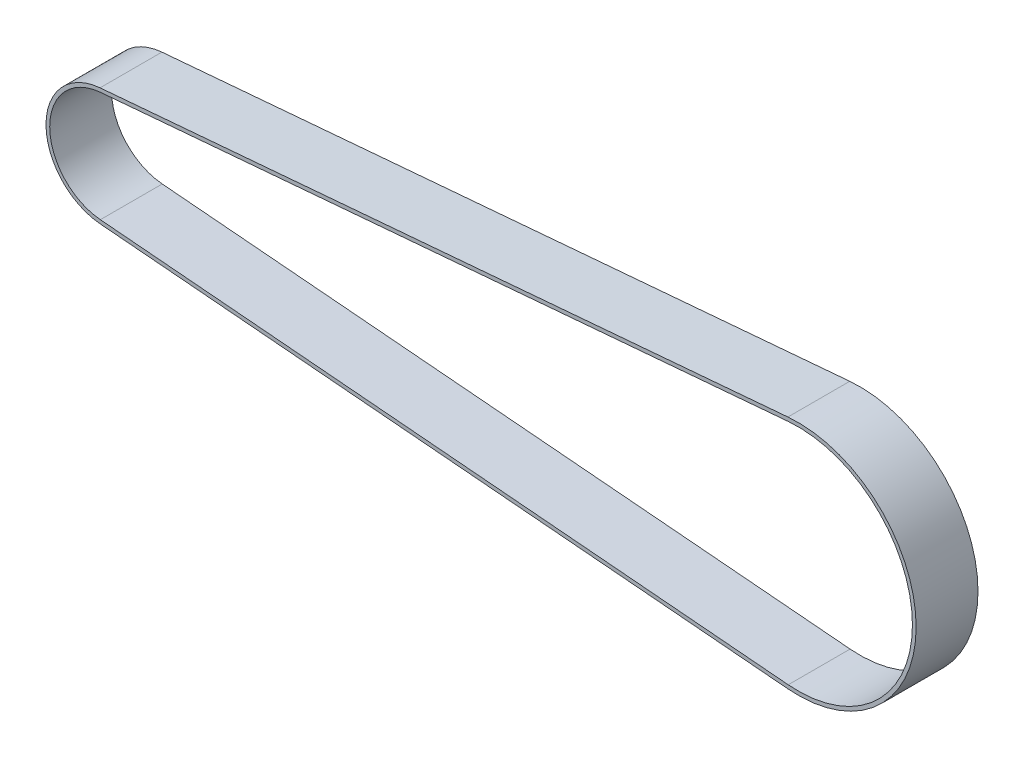
ISO-10303-21;
HEADER;
FILE_DESCRIPTION(('STEP AP214'),'2;1');
FILE_NAME('part.step','',(''),(''),'','','');
FILE_SCHEMA(('AUTOMOTIVE_DESIGN { 1 0 10303 214 1 1 1 1 }'));
ENDSEC;
DATA;
#1=APPLICATION_CONTEXT('core data for automotive mechanical design processes');
#2=APPLICATION_PROTOCOL_DEFINITION('international standard','automotive_design',2000,#1);
#3=PRODUCT_CONTEXT('',#1,'mechanical');
#4=PRODUCT('Part','Part','',(#3));
#5=PRODUCT_RELATED_PRODUCT_CATEGORY('part','',(#4));
#6=PRODUCT_DEFINITION_FORMATION('','',#4);
#7=PRODUCT_DEFINITION_CONTEXT('part definition',#1,'design');
#8=PRODUCT_DEFINITION('design','',#6,#7);
#9=PRODUCT_DEFINITION_SHAPE('','',#8);
#10=(LENGTH_UNIT() NAMED_UNIT(*) SI_UNIT(.MILLI.,.METRE.));
#11=(NAMED_UNIT(*) PLANE_ANGLE_UNIT() SI_UNIT($,.RADIAN.));
#12=(NAMED_UNIT(*) SI_UNIT($,.STERADIAN.) SOLID_ANGLE_UNIT());
#13=UNCERTAINTY_MEASURE_WITH_UNIT(LENGTH_MEASURE(1.E-05),#10,'distance_accuracy_value','');
#14=(GEOMETRIC_REPRESENTATION_CONTEXT(3) GLOBAL_UNCERTAINTY_ASSIGNED_CONTEXT((#13)) GLOBAL_UNIT_ASSIGNED_CONTEXT((#10,
#11,#12)) REPRESENTATION_CONTEXT('',''));
#15=CARTESIAN_POINT('',(0.,0.,0.));
#16=DIRECTION('',(0.,0.,1.));
#17=DIRECTION('',(1.,0.,0.));
#18=AXIS2_PLACEMENT_3D('',#15,#16,#17);
#19=CARTESIAN_POINT('',(1.1959513143159E-13,0.,25.));
#20=DIRECTION('',(0.,0.,1.));
#21=DIRECTION('',(1.,0.,0.));
#22=AXIS2_PLACEMENT_3D('',#19,#20,#21);
#23=PLANE('',#22);
#24=CARTESIAN_POINT('',(1.1959513143159E-13,0.,25.));
#25=DIRECTION('',(0.,0.,1.));
#26=DIRECTION('',(1.,0.,0.));
#27=AXIS2_PLACEMENT_3D('',#24,#25,#26);
#28=CIRCLE('',#27,23.875);
#29=CARTESIAN_POINT('',(-2.03534375,23.7880852701376,25.));
#30=VERTEX_POINT('',#29);
#31=CARTESIAN_POINT('',(-2.03534375,-23.7880852701376,25.));
#32=VERTEX_POINT('',#31);
#33=EDGE_CURVE('E133',#30,#32,#28,.T.);
#34=ORIENTED_EDGE('',*,*,#33,.T.);
#35=DIRECTION('',(0.996359592466495,-0.08525,0.));
#36=VECTOR('',#35,1.);
#37=CARTESIAN_POINT('',(275.92973875,-47.5711887423128,25.));
#38=LINE('',#37,#36);
#39=CARTESIAN_POINT('',(275.92973875,-47.5711887423128,25.));
#40=VERTEX_POINT('',#39);
#41=EDGE_CURVE('E136',#32,#40,#38,.T.);
#42=ORIENTED_EDGE('',*,*,#41,.T.);
#43=CARTESIAN_POINT('',(280.,0.,25.));
#44=DIRECTION('',(0.,0.,1.));
#45=DIRECTION('',(-1.,0.,0.));
#46=AXIS2_PLACEMENT_3D('',#43,#44,#45);
#47=CIRCLE('',#46,47.745);
#48=CARTESIAN_POINT('',(275.92973875,47.5711887423128,25.));
#49=VERTEX_POINT('',#48);
#50=EDGE_CURVE('E139',#40,#49,#47,.T.);
#51=ORIENTED_EDGE('',*,*,#50,.T.);
#52=DIRECTION('',(-0.996359592466495,-0.08525,0.));
#53=VECTOR('',#52,1.);
#54=CARTESIAN_POINT('',(-2.03534375,23.7880852701376,25.));
#55=LINE('',#54,#53);
#56=EDGE_CURVE('E141',#49,#30,#55,.T.);
#57=ORIENTED_EDGE('',*,*,#56,.T.);
#58=EDGE_LOOP('',(#34,#42,#51,#57));
#59=FACE_BOUND('',#58,.T.);
#60=DIRECTION('',(0.996359592466495,-0.08525,0.));
#61=VECTOR('',#60,1.);
#62=CARTESIAN_POINT('',(276.05761375,-46.076649353613,25.));
#63=LINE('',#62,#61);
#64=CARTESIAN_POINT('',(-1.90746874999997,-22.2935458814378,25.));
#65=VERTEX_POINT('',#64);
#66=CARTESIAN_POINT('',(276.05761375,-46.076649353613,25.));
#67=VERTEX_POINT('',#66);
#68=EDGE_CURVE('E105',#65,#67,#63,.T.);
#69=ORIENTED_EDGE('',*,*,#68,.F.);
#70=CARTESIAN_POINT('',(1.1959513143159E-13,0.,25.));
#71=DIRECTION('',(0.,0.,1.));
#72=DIRECTION('',(1.,0.,0.));
#73=AXIS2_PLACEMENT_3D('',#70,#71,#72);
#74=CIRCLE('',#73,22.375);
#75=CARTESIAN_POINT('',(-1.90746875,22.2935458814378,25.));
#76=VERTEX_POINT('',#75);
#77=EDGE_CURVE('E97',#76,#65,#74,.T.);
#78=ORIENTED_EDGE('',*,*,#77,.F.);
#79=DIRECTION('',(-0.996359592466495,-0.08525,0.));
#80=VECTOR('',#79,1.);
#81=CARTESIAN_POINT('',(-1.90746875,22.2935458814378,25.));
#82=LINE('',#81,#80);
#83=CARTESIAN_POINT('',(276.05761375,46.076649353613,25.));
#84=VERTEX_POINT('',#83);
#85=EDGE_CURVE('E119',#84,#76,#82,.T.);
#86=ORIENTED_EDGE('',*,*,#85,.F.);
#87=CARTESIAN_POINT('',(280.,0.,25.));
#88=DIRECTION('',(0.,0.,1.));
#89=DIRECTION('',(-1.,0.,0.));
#90=AXIS2_PLACEMENT_3D('',#87,#88,#89);
#91=CIRCLE('',#90,46.245);
#92=EDGE_CURVE('E117',#67,#84,#91,.T.);
#93=ORIENTED_EDGE('',*,*,#92,.F.);
#94=EDGE_LOOP('',(#69,#78,#86,#93));
#95=FACE_BOUND('',#94,.T.);
#96=ADVANCED_FACE('F32',(#59,#95),#23,.T.);
#97=CARTESIAN_POINT('',(1.1959513143159E-13,0.,0.));
#98=DIRECTION('',(0.,0.,1.));
#99=DIRECTION('',(1.,0.,0.));
#100=AXIS2_PLACEMENT_3D('',#97,#98,#99);
#101=PLANE('',#100);
#102=CARTESIAN_POINT('',(1.1959513143159E-13,0.,0.));
#103=DIRECTION('',(0.,0.,1.));
#104=DIRECTION('',(1.,0.,0.));
#105=AXIS2_PLACEMENT_3D('',#102,#103,#104);
#106=CIRCLE('',#105,23.875);
#107=CARTESIAN_POINT('',(-2.03534375,23.7880852701376,0.));
#108=VERTEX_POINT('',#107);
#109=CARTESIAN_POINT('',(-2.03534375,-23.7880852701376,0.));
#110=VERTEX_POINT('',#109);
#111=EDGE_CURVE('E113',#108,#110,#106,.T.);
#112=ORIENTED_EDGE('',*,*,#111,.F.);
#113=DIRECTION('',(-0.996359592466495,-0.08525,0.));
#114=VECTOR('',#113,1.);
#115=CARTESIAN_POINT('',(-2.03534375,23.7880852701376,0.));
#116=LINE('',#115,#114);
#117=CARTESIAN_POINT('',(275.92973875,47.5711887423128,0.));
#118=VERTEX_POINT('',#117);
#119=EDGE_CURVE('E137',#118,#108,#116,.T.);
#120=ORIENTED_EDGE('',*,*,#119,.F.);
#121=CARTESIAN_POINT('',(280.,0.,0.));
#122=DIRECTION('',(0.,0.,1.));
#123=DIRECTION('',(-1.,0.,0.));
#124=AXIS2_PLACEMENT_3D('',#121,#122,#123);
#125=CIRCLE('',#124,47.745);
#126=CARTESIAN_POINT('',(275.92973875,-47.5711887423128,0.));
#127=VERTEX_POINT('',#126);
#128=EDGE_CURVE('E148',#127,#118,#125,.T.);
#129=ORIENTED_EDGE('',*,*,#128,.F.);
#130=DIRECTION('',(0.996359592466495,-0.08525,0.));
#131=VECTOR('',#130,1.);
#132=CARTESIAN_POINT('',(275.92973875,-47.5711887423128,0.));
#133=LINE('',#132,#131);
#134=EDGE_CURVE('E146',#110,#127,#133,.T.);
#135=ORIENTED_EDGE('',*,*,#134,.F.);
#136=EDGE_LOOP('',(#112,#120,#129,#135));
#137=FACE_BOUND('',#136,.T.);
#138=CARTESIAN_POINT('',(1.1959513143159E-13,0.,0.));
#139=DIRECTION('',(0.,0.,1.));
#140=DIRECTION('',(1.,0.,0.));
#141=AXIS2_PLACEMENT_3D('',#138,#139,#140);
#142=CIRCLE('',#141,22.375);
#143=CARTESIAN_POINT('',(-1.90746875,22.2935458814378,0.));
#144=VERTEX_POINT('',#143);
#145=CARTESIAN_POINT('',(-1.90746874999997,-22.2935458814378,0.));
#146=VERTEX_POINT('',#145);
#147=EDGE_CURVE('E55',#144,#146,#142,.T.);
#148=ORIENTED_EDGE('',*,*,#147,.T.);
#149=DIRECTION('',(0.996359592466495,-0.08525,0.));
#150=VECTOR('',#149,1.);
#151=CARTESIAN_POINT('',(276.05761375,-46.076649353613,0.));
#152=LINE('',#151,#150);
#153=CARTESIAN_POINT('',(276.05761375,-46.076649353613,0.));
#154=VERTEX_POINT('',#153);
#155=EDGE_CURVE('E112',#146,#154,#152,.T.);
#156=ORIENTED_EDGE('',*,*,#155,.T.);
#157=CARTESIAN_POINT('',(280.,0.,0.));
#158=DIRECTION('',(0.,0.,1.));
#159=DIRECTION('',(-1.,0.,0.));
#160=AXIS2_PLACEMENT_3D('',#157,#158,#159);
#161=CIRCLE('',#160,46.245);
#162=CARTESIAN_POINT('',(276.05761375,46.076649353613,0.));
#163=VERTEX_POINT('',#162);
#164=EDGE_CURVE('E125',#154,#163,#161,.T.);
#165=ORIENTED_EDGE('',*,*,#164,.T.);
#166=DIRECTION('',(-0.996359592466495,-0.08525,0.));
#167=VECTOR('',#166,1.);
#168=CARTESIAN_POINT('',(-1.90746875,22.2935458814378,0.));
#169=LINE('',#168,#167);
#170=EDGE_CURVE('E106',#163,#144,#169,.T.);
#171=ORIENTED_EDGE('',*,*,#170,.T.);
#172=EDGE_LOOP('',(#148,#156,#165,#171));
#173=FACE_BOUND('',#172,.T.);
#174=ADVANCED_FACE('F166',(#137,#173),#101,.F.);
#175=CARTESIAN_POINT('',(1.1959513143159E-13,0.,25.));
#176=DIRECTION('',(0.,0.,-1.));
#177=DIRECTION('',(-1.,0.,0.));
#178=AXIS2_PLACEMENT_3D('',#175,#176,#177);
#179=CYLINDRICAL_SURFACE('',#178,23.875);
#180=ORIENTED_EDGE('',*,*,#111,.T.);
#181=DIRECTION('',(0.,0.,-1.));
#182=VECTOR('',#181,1.);
#183=CARTESIAN_POINT('',(-2.03534375,-23.7880852701376,25.));
#184=LINE('',#183,#182);
#185=EDGE_CURVE('E11',#32,#110,#184,.T.);
#186=ORIENTED_EDGE('',*,*,#185,.F.);
#187=ORIENTED_EDGE('',*,*,#33,.F.);
#188=DIRECTION('',(0.,0.,-1.));
#189=VECTOR('',#188,1.);
#190=CARTESIAN_POINT('',(-2.03534375,23.7880852701376,25.));
#191=LINE('',#190,#189);
#192=EDGE_CURVE('E143',#30,#108,#191,.T.);
#193=ORIENTED_EDGE('',*,*,#192,.T.);
#194=EDGE_LOOP('',(#180,#186,#187,#193));
#195=FACE_BOUND('',#194,.T.);
#196=ADVANCED_FACE('F34',(#195),#179,.T.);
#197=CARTESIAN_POINT('',(275.92973875,-47.5711887423128,25.));
#198=DIRECTION('',(0.08525,0.996359592466495,0.));
#199=DIRECTION('',(-0.996359592466495,0.08525,0.));
#200=AXIS2_PLACEMENT_3D('',#197,#198,#199);
#201=PLANE('',#200);
#202=ORIENTED_EDGE('',*,*,#134,.T.);
#203=DIRECTION('',(0.,0.,-1.));
#204=VECTOR('',#203,1.);
#205=CARTESIAN_POINT('',(275.92973875,-47.5711887423128,25.));
#206=LINE('',#205,#204);
#207=EDGE_CURVE('E40',#40,#127,#206,.T.);
#208=ORIENTED_EDGE('',*,*,#207,.F.);
#209=ORIENTED_EDGE('',*,*,#41,.F.);
#210=ORIENTED_EDGE('',*,*,#185,.T.);
#211=EDGE_LOOP('',(#202,#208,#209,#210));
#212=FACE_BOUND('',#211,.T.);
#213=ADVANCED_FACE('F176',(#212),#201,.F.);
#214=CARTESIAN_POINT('',(280.,0.,25.));
#215=DIRECTION('',(0.,0.,-1.));
#216=DIRECTION('',(-1.,0.,0.));
#217=AXIS2_PLACEMENT_3D('',#214,#215,#216);
#218=CYLINDRICAL_SURFACE('',#217,47.745);
#219=ORIENTED_EDGE('',*,*,#128,.T.);
#220=DIRECTION('',(0.,0.,-1.));
#221=VECTOR('',#220,1.);
#222=CARTESIAN_POINT('',(275.92973875,47.5711887423128,25.));
#223=LINE('',#222,#221);
#224=EDGE_CURVE('E153',#49,#118,#223,.T.);
#225=ORIENTED_EDGE('',*,*,#224,.F.);
#226=ORIENTED_EDGE('',*,*,#50,.F.);
#227=ORIENTED_EDGE('',*,*,#207,.T.);
#228=EDGE_LOOP('',(#219,#225,#226,#227));
#229=FACE_BOUND('',#228,.T.);
#230=ADVANCED_FACE('F160',(#229),#218,.T.);
#231=CARTESIAN_POINT('',(-2.03534375,23.7880852701376,25.));
#232=DIRECTION('',(0.08525,-0.996359592466495,0.));
#233=DIRECTION('',(0.996359592466495,0.08525,0.));
#234=AXIS2_PLACEMENT_3D('',#231,#232,#233);
#235=PLANE('',#234);
#236=ORIENTED_EDGE('',*,*,#119,.T.);
#237=ORIENTED_EDGE('',*,*,#192,.F.);
#238=ORIENTED_EDGE('',*,*,#56,.F.);
#239=ORIENTED_EDGE('',*,*,#224,.T.);
#240=EDGE_LOOP('',(#236,#237,#238,#239));
#241=FACE_BOUND('',#240,.T.);
#242=ADVANCED_FACE('F170',(#241),#235,.F.);
#243=CARTESIAN_POINT('',(1.1959513143159E-13,0.,25.));
#244=DIRECTION('',(0.,0.,-1.));
#245=DIRECTION('',(-1.,0.,0.));
#246=AXIS2_PLACEMENT_3D('',#243,#244,#245);
#247=CYLINDRICAL_SURFACE('',#246,22.375);
#248=ORIENTED_EDGE('',*,*,#147,.F.);
#249=DIRECTION('',(0.,0.,-1.));
#250=VECTOR('',#249,1.);
#251=CARTESIAN_POINT('',(-1.90746875,22.2935458814378,25.));
#252=LINE('',#251,#250);
#253=EDGE_CURVE('E101',#76,#144,#252,.T.);
#254=ORIENTED_EDGE('',*,*,#253,.F.);
#255=ORIENTED_EDGE('',*,*,#77,.T.);
#256=DIRECTION('',(0.,0.,-1.));
#257=VECTOR('',#256,1.);
#258=CARTESIAN_POINT('',(-1.90746874999997,-22.2935458814378,25.));
#259=LINE('',#258,#257);
#260=EDGE_CURVE('E100',#65,#146,#259,.T.);
#261=ORIENTED_EDGE('',*,*,#260,.T.);
#262=EDGE_LOOP('',(#248,#254,#255,#261));
#263=FACE_BOUND('',#262,.T.);
#264=ADVANCED_FACE('F99',(#263),#247,.F.);
#265=CARTESIAN_POINT('',(276.05761375,-46.076649353613,25.));
#266=DIRECTION('',(0.08525,0.996359592466495,0.));
#267=DIRECTION('',(-0.996359592466495,0.08525,0.));
#268=AXIS2_PLACEMENT_3D('',#265,#266,#267);
#269=PLANE('',#268);
#270=ORIENTED_EDGE('',*,*,#155,.F.);
#271=ORIENTED_EDGE('',*,*,#260,.F.);
#272=ORIENTED_EDGE('',*,*,#68,.T.);
#273=DIRECTION('',(0.,0.,-1.));
#274=VECTOR('',#273,1.);
#275=CARTESIAN_POINT('',(276.05761375,-46.076649353613,25.));
#276=LINE('',#275,#274);
#277=EDGE_CURVE('E114',#67,#154,#276,.T.);
#278=ORIENTED_EDGE('',*,*,#277,.T.);
#279=EDGE_LOOP('',(#270,#271,#272,#278));
#280=FACE_BOUND('',#279,.T.);
#281=ADVANCED_FACE('F109',(#280),#269,.T.);
#282=CARTESIAN_POINT('',(280.,0.,25.));
#283=DIRECTION('',(0.,0.,-1.));
#284=DIRECTION('',(-1.,0.,0.));
#285=AXIS2_PLACEMENT_3D('',#282,#283,#284);
#286=CYLINDRICAL_SURFACE('',#285,46.245);
#287=ORIENTED_EDGE('',*,*,#164,.F.);
#288=ORIENTED_EDGE('',*,*,#277,.F.);
#289=ORIENTED_EDGE('',*,*,#92,.T.);
#290=DIRECTION('',(0.,0.,-1.));
#291=VECTOR('',#290,1.);
#292=CARTESIAN_POINT('',(276.05761375,46.076649353613,25.));
#293=LINE('',#292,#291);
#294=EDGE_CURVE('E47',#84,#163,#293,.T.);
#295=ORIENTED_EDGE('',*,*,#294,.T.);
#296=EDGE_LOOP('',(#287,#288,#289,#295));
#297=FACE_BOUND('',#296,.T.);
#298=ADVANCED_FACE('F199',(#297),#286,.F.);
#299=CARTESIAN_POINT('',(-1.90746875,22.2935458814378,25.));
#300=DIRECTION('',(0.08525,-0.996359592466495,0.));
#301=DIRECTION('',(0.996359592466495,0.08525,0.));
#302=AXIS2_PLACEMENT_3D('',#299,#300,#301);
#303=PLANE('',#302);
#304=ORIENTED_EDGE('',*,*,#170,.F.);
#305=ORIENTED_EDGE('',*,*,#294,.F.);
#306=ORIENTED_EDGE('',*,*,#85,.T.);
#307=ORIENTED_EDGE('',*,*,#253,.T.);
#308=EDGE_LOOP('',(#304,#305,#306,#307));
#309=FACE_BOUND('',#308,.T.);
#310=ADVANCED_FACE('F203',(#309),#303,.T.);
#311=CLOSED_SHELL('',(#96,#174,#196,#213,#230,#242,#264,#281,#298,#310));
#312=MANIFOLD_SOLID_BREP('B2',#311);
#313=ADVANCED_BREP_SHAPE_REPRESENTATION('',(#18,#312),#14);
#314=SHAPE_DEFINITION_REPRESENTATION(#9,#313);
ENDSEC;
END-ISO-10303-21;
